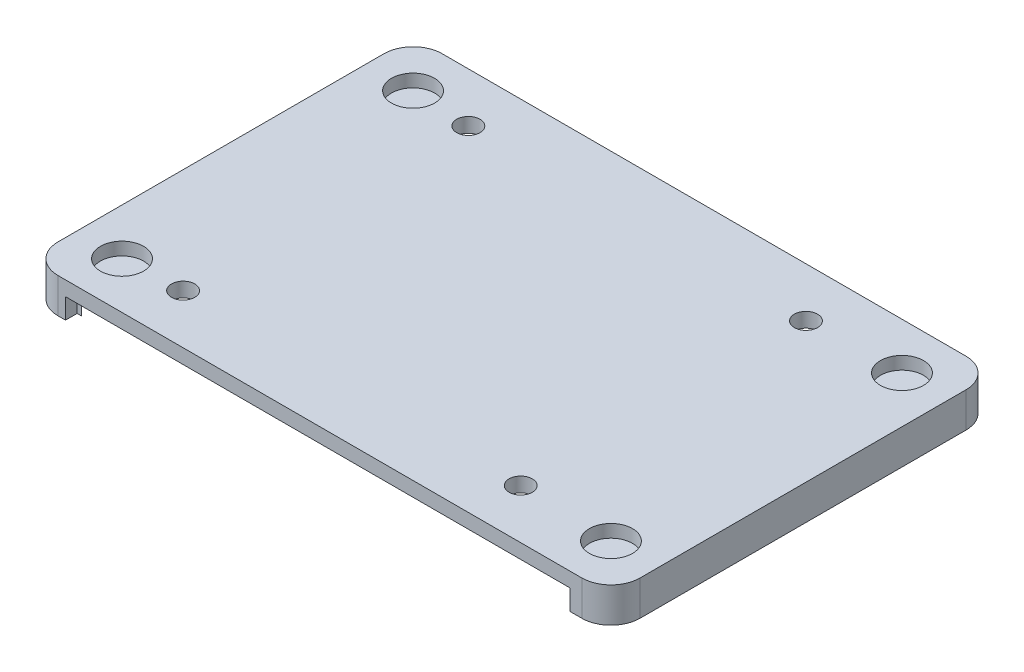
ISO-10303-21;
HEADER;
FILE_DESCRIPTION(('STEP AP214'),'2;1');
FILE_NAME('part.step','',(''),(''),'','','');
FILE_SCHEMA(('AUTOMOTIVE_DESIGN { 1 0 10303 214 1 1 1 1 }'));
ENDSEC;
DATA;
#1=APPLICATION_CONTEXT('core data for automotive mechanical design processes');
#2=APPLICATION_PROTOCOL_DEFINITION('international standard','automotive_design',2000,#1);
#3=PRODUCT_CONTEXT('',#1,'mechanical');
#4=PRODUCT('Part','Part','',(#3));
#5=PRODUCT_RELATED_PRODUCT_CATEGORY('part','',(#4));
#6=PRODUCT_DEFINITION_FORMATION('','',#4);
#7=PRODUCT_DEFINITION_CONTEXT('part definition',#1,'design');
#8=PRODUCT_DEFINITION('design','',#6,#7);
#9=PRODUCT_DEFINITION_SHAPE('','',#8);
#10=(LENGTH_UNIT() NAMED_UNIT(*) SI_UNIT(.MILLI.,.METRE.));
#11=(NAMED_UNIT(*) PLANE_ANGLE_UNIT() SI_UNIT($,.RADIAN.));
#12=(NAMED_UNIT(*) SI_UNIT($,.STERADIAN.) SOLID_ANGLE_UNIT());
#13=UNCERTAINTY_MEASURE_WITH_UNIT(LENGTH_MEASURE(1.E-05),#10,'distance_accuracy_value','');
#14=(GEOMETRIC_REPRESENTATION_CONTEXT(3) GLOBAL_UNCERTAINTY_ASSIGNED_CONTEXT((#13)) GLOBAL_UNIT_ASSIGNED_CONTEXT((#10,
#11,#12)) REPRESENTATION_CONTEXT('',''));
#15=CARTESIAN_POINT('',(0.,0.,0.));
#16=DIRECTION('',(0.,0.,1.));
#17=DIRECTION('',(1.,0.,0.));
#18=AXIS2_PLACEMENT_3D('',#15,#16,#17);
#19=CARTESIAN_POINT('',(0.,6.,-5.00000000000004));
#20=DIRECTION('',(-1.,0.,0.));
#21=DIRECTION('',(0.,0.,1.));
#22=AXIS2_PLACEMENT_3D('',#19,#20,#21);
#23=PLANE('',#22);
#24=DIRECTION('',(0.,-1.,0.));
#25=VECTOR('',#24,1.);
#26=CARTESIAN_POINT('',(0.,6.,-61.));
#27=LINE('',#26,#25);
#28=CARTESIAN_POINT('',(0.,6.,-61.));
#29=VERTEX_POINT('',#28);
#30=CARTESIAN_POINT('',(0.,3.5,-61.));
#31=VERTEX_POINT('',#30);
#32=EDGE_CURVE('E170',#29,#31,#27,.T.);
#33=ORIENTED_EDGE('',*,*,#32,.T.);
#34=DIRECTION('',(0.,0.,-1.));
#35=VECTOR('',#34,1.);
#36=CARTESIAN_POINT('',(0.,3.5,-5.00000000000004));
#37=LINE('',#36,#35);
#38=CARTESIAN_POINT('',(0.,3.5,-5.00000000000004));
#39=VERTEX_POINT('',#38);
#40=EDGE_CURVE('E275',#39,#31,#37,.T.);
#41=ORIENTED_EDGE('',*,*,#40,.F.);
#42=DIRECTION('',(0.,-1.,0.));
#43=VECTOR('',#42,1.);
#44=CARTESIAN_POINT('',(0.,6.,-5.00000000000004));
#45=LINE('',#44,#43);
#46=CARTESIAN_POINT('',(0.,6.,-5.00000000000004));
#47=VERTEX_POINT('',#46);
#48=EDGE_CURVE('E93',#47,#39,#45,.T.);
#49=ORIENTED_EDGE('',*,*,#48,.F.);
#50=DIRECTION('',(0.,0.,-1.));
#51=VECTOR('',#50,1.);
#52=CARTESIAN_POINT('',(0.,6.,-5.00000000000004));
#53=LINE('',#52,#51);
#54=EDGE_CURVE('E255',#47,#29,#53,.T.);
#55=ORIENTED_EDGE('',*,*,#54,.T.);
#56=EDGE_LOOP('',(#33,#41,#49,#55));
#57=FACE_BOUND('',#56,.T.);
#58=ADVANCED_FACE('F35',(#57),#23,.T.);
#59=CARTESIAN_POINT('',(5.,0.,-5.));
#60=DIRECTION('',(0.,-1.,0.));
#61=DIRECTION('',(0.,0.,-1.));
#62=AXIS2_PLACEMENT_3D('',#59,#60,#61);
#63=PLANE('',#62);
#64=DIRECTION('',(-1.,0.,0.));
#65=VECTOR('',#64,1.);
#66=CARTESIAN_POINT('',(0.,0.,-5.00000000000004));
#67=LINE('',#66,#65);
#68=CARTESIAN_POINT('',(2.41742430504418,0.,-5.00000000000004));
#69=VERTEX_POINT('',#68);
#70=CARTESIAN_POINT('',(0.,0.,-5.00000000000004));
#71=VERTEX_POINT('',#70);
#72=EDGE_CURVE('E545',#69,#71,#67,.T.);
#73=ORIENTED_EDGE('',*,*,#72,.F.);
#74=CARTESIAN_POINT('',(7.,0.,-7.));
#75=DIRECTION('',(0.,-1.,0.));
#76=DIRECTION('',(0.,0.,-1.));
#77=AXIS2_PLACEMENT_3D('',#74,#75,#76);
#78=CIRCLE('',#77,5.);
#79=CARTESIAN_POINT('',(7.00000000000006,0.,-2.));
#80=VERTEX_POINT('',#79);
#81=EDGE_CURVE('E232',#80,#69,#78,.T.);
#82=ORIENTED_EDGE('',*,*,#81,.F.);
#83=DIRECTION('',(1.,0.,0.));
#84=VECTOR('',#83,1.);
#85=CARTESIAN_POINT('',(93.,0.,-2.));
#86=LINE('',#85,#84);
#87=CARTESIAN_POINT('',(6.29077173658593,0.,-2.));
#88=VERTEX_POINT('',#87);
#89=EDGE_CURVE('E421',#88,#80,#86,.T.);
#90=ORIENTED_EDGE('',*,*,#89,.F.);
#91=DIRECTION('',(0.,0.,-1.));
#92=VECTOR('',#91,1.);
#93=CARTESIAN_POINT('',(6.29077173658593,0.,-2.));
#94=LINE('',#93,#92);
#95=CARTESIAN_POINT('',(6.29077173658593,0.,0.));
#96=VERTEX_POINT('',#95);
#97=EDGE_CURVE('E436',#96,#88,#94,.T.);
#98=ORIENTED_EDGE('',*,*,#97,.F.);
#99=DIRECTION('',(1.,0.,0.));
#100=VECTOR('',#99,1.);
#101=CARTESIAN_POINT('',(5.00000000000004,0.,0.));
#102=LINE('',#101,#100);
#103=CARTESIAN_POINT('',(5.00000000000004,0.,0.));
#104=VERTEX_POINT('',#103);
#105=EDGE_CURVE('E161',#104,#96,#102,.T.);
#106=ORIENTED_EDGE('',*,*,#105,.F.);
#107=CARTESIAN_POINT('',(5.,0.,-5.));
#108=DIRECTION('',(0.,-1.,0.));
#109=DIRECTION('',(0.,0.,-1.));
#110=AXIS2_PLACEMENT_3D('',#107,#108,#109);
#111=CIRCLE('',#110,5.);
#112=EDGE_CURVE('E144',#104,#71,#111,.T.);
#113=ORIENTED_EDGE('',*,*,#112,.T.);
#114=EDGE_LOOP('',(#73,#82,#90,#98,#106,#113));
#115=FACE_BOUND('',#114,.T.);
#116=ADVANCED_FACE('F378',(#115),#63,.T.);
#117=CARTESIAN_POINT('',(5.,6.,-5.));
#118=DIRECTION('',(0.,-1.,0.));
#119=DIRECTION('',(0.,0.,-1.));
#120=AXIS2_PLACEMENT_3D('',#117,#118,#119);
#121=CYLINDRICAL_SURFACE('',#120,5.);
#122=ORIENTED_EDGE('',*,*,#112,.F.);
#123=DIRECTION('',(0.,-1.,0.));
#124=VECTOR('',#123,1.);
#125=CARTESIAN_POINT('',(5.00000000000004,6.,0.));
#126=LINE('',#125,#124);
#127=CARTESIAN_POINT('',(5.00000000000004,6.,0.));
#128=VERTEX_POINT('',#127);
#129=EDGE_CURVE('E11',#128,#104,#126,.T.);
#130=ORIENTED_EDGE('',*,*,#129,.F.);
#131=CARTESIAN_POINT('',(5.,6.,-5.));
#132=DIRECTION('',(0.,-1.,0.));
#133=DIRECTION('',(0.,0.,-1.));
#134=AXIS2_PLACEMENT_3D('',#131,#132,#133);
#135=CIRCLE('',#134,5.);
#136=EDGE_CURVE('E162',#128,#47,#135,.T.);
#137=ORIENTED_EDGE('',*,*,#136,.T.);
#138=ORIENTED_EDGE('',*,*,#48,.T.);
#139=DIRECTION('',(0.,-1.,0.));
#140=VECTOR('',#139,1.);
#141=CARTESIAN_POINT('',(0.,3.5,-5.00000000000004));
#142=LINE('',#141,#140);
#143=EDGE_CURVE('E449',#39,#71,#142,.T.);
#144=ORIENTED_EDGE('',*,*,#143,.T.);
#145=EDGE_LOOP('',(#122,#130,#137,#138,#144));
#146=FACE_BOUND('',#145,.T.);
#147=ADVANCED_FACE('F37',(#146),#121,.T.);
#148=CARTESIAN_POINT('',(5.00000000000004,6.,0.));
#149=DIRECTION('',(0.,0.,-1.));
#150=DIRECTION('',(-1.,0.,0.));
#151=AXIS2_PLACEMENT_3D('',#148,#149,#150);
#152=PLANE('',#151);
#153=DIRECTION('',(-1.,0.,0.));
#154=VECTOR('',#153,1.);
#155=CARTESIAN_POINT('',(93.,3.5,0.));
#156=LINE('',#155,#154);
#157=CARTESIAN_POINT('',(93.,3.5,0.));
#158=VERTEX_POINT('',#157);
#159=CARTESIAN_POINT('',(6.29077173658593,3.5,0.));
#160=VERTEX_POINT('',#159);
#161=EDGE_CURVE('E418',#158,#160,#156,.T.);
#162=ORIENTED_EDGE('',*,*,#161,.F.);
#163=DIRECTION('',(0.,-1.,0.));
#164=VECTOR('',#163,1.);
#165=CARTESIAN_POINT('',(93.,3.5,0.));
#166=LINE('',#165,#164);
#167=CARTESIAN_POINT('',(93.,0.,0.));
#168=VERTEX_POINT('',#167);
#169=EDGE_CURVE('E424',#158,#168,#166,.T.);
#170=ORIENTED_EDGE('',*,*,#169,.T.);
#171=CARTESIAN_POINT('',(95.,0.,0.));
#172=VERTEX_POINT('',#171);
#173=EDGE_CURVE('E160',#168,#172,#102,.T.);
#174=ORIENTED_EDGE('',*,*,#173,.T.);
#175=DIRECTION('',(0.,-1.,0.));
#176=VECTOR('',#175,1.);
#177=CARTESIAN_POINT('',(95.,6.,0.));
#178=LINE('',#177,#176);
#179=CARTESIAN_POINT('',(95.,6.,0.));
#180=VERTEX_POINT('',#179);
#181=EDGE_CURVE('E44',#180,#172,#178,.T.);
#182=ORIENTED_EDGE('',*,*,#181,.F.);
#183=DIRECTION('',(1.,0.,0.));
#184=VECTOR('',#183,1.);
#185=CARTESIAN_POINT('',(5.00000000000004,6.,0.));
#186=LINE('',#185,#184);
#187=EDGE_CURVE('E120',#128,#180,#186,.T.);
#188=ORIENTED_EDGE('',*,*,#187,.F.);
#189=ORIENTED_EDGE('',*,*,#129,.T.);
#190=ORIENTED_EDGE('',*,*,#105,.T.);
#191=DIRECTION('',(0.,-1.,0.));
#192=VECTOR('',#191,1.);
#193=CARTESIAN_POINT('',(6.29077173658593,3.5,0.));
#194=LINE('',#193,#192);
#195=EDGE_CURVE('E426',#160,#96,#194,.T.);
#196=ORIENTED_EDGE('',*,*,#195,.F.);
#197=EDGE_LOOP('',(#162,#170,#174,#182,#188,#189,#190,#196));
#198=FACE_BOUND('',#197,.T.);
#199=ADVANCED_FACE('F397',(#198),#152,.F.);
#200=CARTESIAN_POINT('',(95.,6.,-5.));
#201=DIRECTION('',(0.,-1.,0.));
#202=DIRECTION('',(0.,0.,-1.));
#203=AXIS2_PLACEMENT_3D('',#200,#201,#202);
#204=CYLINDRICAL_SURFACE('',#203,5.);
#205=CARTESIAN_POINT('',(95.,0.,-5.));
#206=DIRECTION('',(0.,1.,0.));
#207=DIRECTION('',(0.,0.,1.));
#208=AXIS2_PLACEMENT_3D('',#205,#206,#207);
#209=CIRCLE('',#208,5.);
#210=CARTESIAN_POINT('',(100.,0.,-5.00000000000004));
#211=VERTEX_POINT('',#210);
#212=EDGE_CURVE('E129',#172,#211,#209,.T.);
#213=ORIENTED_EDGE('',*,*,#212,.T.);
#214=DIRECTION('',(0.,-1.,0.));
#215=VECTOR('',#214,1.);
#216=CARTESIAN_POINT('',(100.,6.,-5.00000000000004));
#217=LINE('',#216,#215);
#218=CARTESIAN_POINT('',(100.,6.,-5.00000000000004));
#219=VERTEX_POINT('',#218);
#220=EDGE_CURVE('E126',#219,#211,#217,.T.);
#221=ORIENTED_EDGE('',*,*,#220,.F.);
#222=CARTESIAN_POINT('',(95.,6.,-5.));
#223=DIRECTION('',(0.,1.,0.));
#224=DIRECTION('',(0.,0.,1.));
#225=AXIS2_PLACEMENT_3D('',#222,#223,#224);
#226=CIRCLE('',#225,5.);
#227=EDGE_CURVE('E112',#180,#219,#226,.T.);
#228=ORIENTED_EDGE('',*,*,#227,.F.);
#229=ORIENTED_EDGE('',*,*,#181,.T.);
#230=EDGE_LOOP('',(#213,#221,#228,#229));
#231=FACE_BOUND('',#230,.T.);
#232=ADVANCED_FACE('F127',(#231),#204,.T.);
#233=CARTESIAN_POINT('',(100.,6.,-5.00000000000004));
#234=DIRECTION('',(-1.,0.,0.));
#235=DIRECTION('',(0.,0.,1.));
#236=AXIS2_PLACEMENT_3D('',#233,#234,#235);
#237=PLANE('',#236);
#238=DIRECTION('',(0.,0.,-1.));
#239=VECTOR('',#238,1.);
#240=CARTESIAN_POINT('',(100.,0.,-5.00000000000004));
#241=LINE('',#240,#239);
#242=CARTESIAN_POINT('',(100.,0.,-61.));
#243=VERTEX_POINT('',#242);
#244=EDGE_CURVE('E157',#211,#243,#241,.T.);
#245=ORIENTED_EDGE('',*,*,#244,.T.);
#246=DIRECTION('',(0.,-1.,0.));
#247=VECTOR('',#246,1.);
#248=CARTESIAN_POINT('',(100.,6.,-61.));
#249=LINE('',#248,#247);
#250=CARTESIAN_POINT('',(100.,6.,-61.));
#251=VERTEX_POINT('',#250);
#252=EDGE_CURVE('E133',#251,#243,#249,.T.);
#253=ORIENTED_EDGE('',*,*,#252,.F.);
#254=DIRECTION('',(0.,0.,-1.));
#255=VECTOR('',#254,1.);
#256=CARTESIAN_POINT('',(100.,6.,-5.00000000000004));
#257=LINE('',#256,#255);
#258=EDGE_CURVE('E118',#219,#251,#257,.T.);
#259=ORIENTED_EDGE('',*,*,#258,.F.);
#260=ORIENTED_EDGE('',*,*,#220,.T.);
#261=EDGE_LOOP('',(#245,#253,#259,#260));
#262=FACE_BOUND('',#261,.T.);
#263=ADVANCED_FACE('F135',(#262),#237,.F.);
#264=CARTESIAN_POINT('',(95.,6.,-61.));
#265=DIRECTION('',(0.,-1.,0.));
#266=DIRECTION('',(0.,0.,-1.));
#267=AXIS2_PLACEMENT_3D('',#264,#265,#266);
#268=CYLINDRICAL_SURFACE('',#267,5.);
#269=CARTESIAN_POINT('',(95.,0.,-61.));
#270=DIRECTION('',(0.,-1.,0.));
#271=DIRECTION('',(0.,0.,-1.));
#272=AXIS2_PLACEMENT_3D('',#269,#270,#271);
#273=CIRCLE('',#272,5.);
#274=CARTESIAN_POINT('',(95.,0.,-66.));
#275=VERTEX_POINT('',#274);
#276=EDGE_CURVE('E154',#275,#243,#273,.T.);
#277=ORIENTED_EDGE('',*,*,#276,.F.);
#278=DIRECTION('',(0.,-1.,0.));
#279=VECTOR('',#278,1.);
#280=CARTESIAN_POINT('',(95.,6.,-66.));
#281=LINE('',#280,#279);
#282=CARTESIAN_POINT('',(95.,6.,-66.));
#283=VERTEX_POINT('',#282);
#284=EDGE_CURVE('E166',#283,#275,#281,.T.);
#285=ORIENTED_EDGE('',*,*,#284,.F.);
#286=CARTESIAN_POINT('',(95.,6.,-61.));
#287=DIRECTION('',(0.,-1.,0.));
#288=DIRECTION('',(0.,0.,-1.));
#289=AXIS2_PLACEMENT_3D('',#286,#287,#288);
#290=CIRCLE('',#289,5.);
#291=EDGE_CURVE('E137',#283,#251,#290,.T.);
#292=ORIENTED_EDGE('',*,*,#291,.T.);
#293=ORIENTED_EDGE('',*,*,#252,.T.);
#294=EDGE_LOOP('',(#277,#285,#292,#293));
#295=FACE_BOUND('',#294,.T.);
#296=ADVANCED_FACE('F389',(#295),#268,.T.);
#297=CARTESIAN_POINT('',(5.00000000000004,6.,-66.));
#298=DIRECTION('',(0.,0.,-1.));
#299=DIRECTION('',(-1.,0.,0.));
#300=AXIS2_PLACEMENT_3D('',#297,#298,#299);
#301=PLANE('',#300);
#302=DIRECTION('',(1.,0.,0.));
#303=VECTOR('',#302,1.);
#304=CARTESIAN_POINT('',(5.00000000000004,0.,-66.));
#305=LINE('',#304,#303);
#306=CARTESIAN_POINT('',(5.,0.,-66.));
#307=VERTEX_POINT('',#306);
#308=EDGE_CURVE('E151',#307,#275,#305,.T.);
#309=ORIENTED_EDGE('',*,*,#308,.F.);
#310=DIRECTION('',(0.,-1.,0.));
#311=VECTOR('',#310,1.);
#312=CARTESIAN_POINT('',(5.,6.,-66.));
#313=LINE('',#312,#311);
#314=CARTESIAN_POINT('',(5.,6.,-66.));
#315=VERTEX_POINT('',#314);
#316=EDGE_CURVE('E168',#315,#307,#313,.T.);
#317=ORIENTED_EDGE('',*,*,#316,.F.);
#318=DIRECTION('',(1.,0.,0.));
#319=VECTOR('',#318,1.);
#320=CARTESIAN_POINT('',(5.00000000000004,6.,-66.));
#321=LINE('',#320,#319);
#322=EDGE_CURVE('E139',#315,#283,#321,.T.);
#323=ORIENTED_EDGE('',*,*,#322,.T.);
#324=ORIENTED_EDGE('',*,*,#284,.T.);
#325=EDGE_LOOP('',(#309,#317,#323,#324));
#326=FACE_BOUND('',#325,.T.);
#327=ADVANCED_FACE('F263',(#326),#301,.T.);
#328=CARTESIAN_POINT('',(5.,6.,-61.));
#329=DIRECTION('',(0.,-1.,0.));
#330=DIRECTION('',(0.,0.,-1.));
#331=AXIS2_PLACEMENT_3D('',#328,#329,#330);
#332=CYLINDRICAL_SURFACE('',#331,5.);
#333=CARTESIAN_POINT('',(5.,0.,-61.));
#334=DIRECTION('',(0.,-1.,0.));
#335=DIRECTION('',(0.,0.,-1.));
#336=AXIS2_PLACEMENT_3D('',#333,#334,#335);
#337=CIRCLE('',#336,5.);
#338=CARTESIAN_POINT('',(0.,0.,-61.));
#339=VERTEX_POINT('',#338);
#340=EDGE_CURVE('E147',#339,#307,#337,.T.);
#341=ORIENTED_EDGE('',*,*,#340,.F.);
#342=DIRECTION('',(0.,-1.,0.));
#343=VECTOR('',#342,1.);
#344=CARTESIAN_POINT('',(0.,3.5,-61.));
#345=LINE('',#344,#343);
#346=EDGE_CURVE('E272',#31,#339,#345,.T.);
#347=ORIENTED_EDGE('',*,*,#346,.F.);
#348=ORIENTED_EDGE('',*,*,#32,.F.);
#349=CARTESIAN_POINT('',(5.,6.,-61.));
#350=DIRECTION('',(0.,-1.,0.));
#351=DIRECTION('',(0.,0.,-1.));
#352=AXIS2_PLACEMENT_3D('',#349,#350,#351);
#353=CIRCLE('',#352,5.);
#354=EDGE_CURVE('E257',#29,#315,#353,.T.);
#355=ORIENTED_EDGE('',*,*,#354,.T.);
#356=ORIENTED_EDGE('',*,*,#316,.T.);
#357=EDGE_LOOP('',(#341,#347,#348,#355,#356));
#358=FACE_BOUND('',#357,.T.);
#359=ADVANCED_FACE('F268',(#358),#332,.T.);
#360=CARTESIAN_POINT('',(5.,6.,-5.));
#361=DIRECTION('',(0.,-1.,0.));
#362=DIRECTION('',(0.,0.,-1.));
#363=AXIS2_PLACEMENT_3D('',#360,#361,#362);
#364=PLANE('',#363);
#365=CARTESIAN_POINT('',(18.,6.,-8.5));
#366=DIRECTION('',(0.,1.,0.));
#367=DIRECTION('',(0.,0.,1.));
#368=AXIS2_PLACEMENT_3D('',#365,#366,#367);
#369=CIRCLE('',#368,2.);
#370=CARTESIAN_POINT('',(18.,6.,-6.5));
#371=VERTEX_POINT('',#370);
#372=EDGE_CURVE('E450',#371,#371,#369,.T.);
#373=ORIENTED_EDGE('',*,*,#372,.F.);
#374=EDGE_LOOP('',(#373));
#375=FACE_BOUND('',#374,.T.);
#376=CARTESIAN_POINT('',(76.,6.,-57.5));
#377=DIRECTION('',(0.,1.,0.));
#378=DIRECTION('',(0.,0.,1.));
#379=AXIS2_PLACEMENT_3D('',#376,#377,#378);
#380=CIRCLE('',#379,2.);
#381=CARTESIAN_POINT('',(76.,6.,-55.5));
#382=VERTEX_POINT('',#381);
#383=EDGE_CURVE('E448',#382,#382,#380,.T.);
#384=ORIENTED_EDGE('',*,*,#383,.F.);
#385=EDGE_LOOP('',(#384));
#386=FACE_BOUND('',#385,.T.);
#387=CARTESIAN_POINT('',(76.,6.,-8.5));
#388=DIRECTION('',(0.,1.,0.));
#389=DIRECTION('',(0.,0.,1.));
#390=AXIS2_PLACEMENT_3D('',#387,#388,#389);
#391=CIRCLE('',#390,2.);
#392=CARTESIAN_POINT('',(76.,6.,-6.5));
#393=VERTEX_POINT('',#392);
#394=EDGE_CURVE('E445',#393,#393,#391,.T.);
#395=ORIENTED_EDGE('',*,*,#394,.F.);
#396=EDGE_LOOP('',(#395));
#397=FACE_BOUND('',#396,.T.);
#398=CARTESIAN_POINT('',(18.,6.,-57.5));
#399=DIRECTION('',(0.,1.,0.));
#400=DIRECTION('',(0.,0.,1.));
#401=AXIS2_PLACEMENT_3D('',#398,#399,#400);
#402=CIRCLE('',#401,2.);
#403=CARTESIAN_POINT('',(18.,6.,-55.5));
#404=VERTEX_POINT('',#403);
#405=EDGE_CURVE('E178',#404,#404,#402,.T.);
#406=ORIENTED_EDGE('',*,*,#405,.F.);
#407=EDGE_LOOP('',(#406));
#408=FACE_BOUND('',#407,.T.);
#409=CARTESIAN_POINT('',(92.,6.,-58.));
#410=DIRECTION('',(0.,1.,0.));
#411=DIRECTION('',(0.,0.,1.));
#412=AXIS2_PLACEMENT_3D('',#409,#410,#411);
#413=CIRCLE('',#412,3.7);
#414=CARTESIAN_POINT('',(92.,6.,-54.3));
#415=VERTEX_POINT('',#414);
#416=EDGE_CURVE('E185',#415,#415,#413,.T.);
#417=ORIENTED_EDGE('',*,*,#416,.F.);
#418=EDGE_LOOP('',(#417));
#419=FACE_BOUND('',#418,.T.);
#420=CARTESIAN_POINT('',(92.,6.,-8.));
#421=DIRECTION('',(0.,1.,0.));
#422=DIRECTION('',(0.,0.,1.));
#423=AXIS2_PLACEMENT_3D('',#420,#421,#422);
#424=CIRCLE('',#423,3.69999999999999);
#425=CARTESIAN_POINT('',(92.,6.,-4.30000000000001));
#426=VERTEX_POINT('',#425);
#427=EDGE_CURVE('E194',#426,#426,#424,.T.);
#428=ORIENTED_EDGE('',*,*,#427,.F.);
#429=EDGE_LOOP('',(#428));
#430=FACE_BOUND('',#429,.T.);
#431=CARTESIAN_POINT('',(8.,6.,-8.));
#432=DIRECTION('',(0.,1.,0.));
#433=DIRECTION('',(0.,0.,1.));
#434=AXIS2_PLACEMENT_3D('',#431,#432,#433);
#435=CIRCLE('',#434,3.7);
#436=CARTESIAN_POINT('',(8.,6.,-4.3));
#437=VERTEX_POINT('',#436);
#438=EDGE_CURVE('E459',#437,#437,#435,.T.);
#439=ORIENTED_EDGE('',*,*,#438,.F.);
#440=EDGE_LOOP('',(#439));
#441=FACE_BOUND('',#440,.T.);
#442=CARTESIAN_POINT('',(8.,6.,-58.));
#443=DIRECTION('',(0.,1.,0.));
#444=DIRECTION('',(0.,0.,1.));
#445=AXIS2_PLACEMENT_3D('',#442,#443,#444);
#446=CIRCLE('',#445,3.7);
#447=CARTESIAN_POINT('',(8.,6.,-54.3));
#448=VERTEX_POINT('',#447);
#449=EDGE_CURVE('E201',#448,#448,#446,.T.);
#450=ORIENTED_EDGE('',*,*,#449,.F.);
#451=EDGE_LOOP('',(#450));
#452=FACE_BOUND('',#451,.T.);
#453=ORIENTED_EDGE('',*,*,#136,.F.);
#454=ORIENTED_EDGE('',*,*,#187,.T.);
#455=ORIENTED_EDGE('',*,*,#227,.T.);
#456=ORIENTED_EDGE('',*,*,#258,.T.);
#457=ORIENTED_EDGE('',*,*,#291,.F.);
#458=ORIENTED_EDGE('',*,*,#322,.F.);
#459=ORIENTED_EDGE('',*,*,#354,.F.);
#460=ORIENTED_EDGE('',*,*,#54,.F.);
#461=EDGE_LOOP('',(#453,#454,#455,#456,#457,#458,#459,#460));
#462=FACE_BOUND('',#461,.T.);
#463=ADVANCED_FACE('F115',(#375,#386,#397,#408,#419,#430,#441,#452,#462),#364,.F.);
#464=DIRECTION('',(1.,0.,0.));
#465=VECTOR('',#464,1.);
#466=CARTESIAN_POINT('',(0.,0.,-61.));
#467=LINE('',#466,#465);
#468=CARTESIAN_POINT('',(2.41742430504418,0.,-61.));
#469=VERTEX_POINT('',#468);
#470=EDGE_CURVE('E442',#339,#469,#467,.T.);
#471=ORIENTED_EDGE('',*,*,#470,.F.);
#472=ORIENTED_EDGE('',*,*,#340,.T.);
#473=ORIENTED_EDGE('',*,*,#308,.T.);
#474=ORIENTED_EDGE('',*,*,#276,.T.);
#475=ORIENTED_EDGE('',*,*,#244,.F.);
#476=ORIENTED_EDGE('',*,*,#212,.F.);
#477=ORIENTED_EDGE('',*,*,#173,.F.);
#478=DIRECTION('',(0.,0.,1.));
#479=VECTOR('',#478,1.);
#480=CARTESIAN_POINT('',(93.,0.,-2.));
#481=LINE('',#480,#479);
#482=CARTESIAN_POINT('',(93.,0.,-2.));
#483=VERTEX_POINT('',#482);
#484=EDGE_CURVE('E434',#483,#168,#481,.T.);
#485=ORIENTED_EDGE('',*,*,#484,.F.);
#486=CARTESIAN_POINT('',(93.,0.,-7.));
#487=DIRECTION('',(0.,-1.,0.));
#488=DIRECTION('',(0.,0.,1.));
#489=AXIS2_PLACEMENT_3D('',#486,#487,#488);
#490=CIRCLE('',#489,5.);
#491=CARTESIAN_POINT('',(98.,0.,-7.00000000000003));
#492=VERTEX_POINT('',#491);
#493=EDGE_CURVE('E229',#492,#483,#490,.T.);
#494=ORIENTED_EDGE('',*,*,#493,.F.);
#495=DIRECTION('',(0.,0.,1.));
#496=VECTOR('',#495,1.);
#497=CARTESIAN_POINT('',(98.,0.,-7.00000000000003));
#498=LINE('',#497,#496);
#499=CARTESIAN_POINT('',(98.,0.,-59.));
#500=VERTEX_POINT('',#499);
#501=EDGE_CURVE('E226',#500,#492,#498,.T.);
#502=ORIENTED_EDGE('',*,*,#501,.F.);
#503=CARTESIAN_POINT('',(93.,0.,-59.));
#504=DIRECTION('',(0.,-1.,0.));
#505=DIRECTION('',(0.,0.,-1.));
#506=AXIS2_PLACEMENT_3D('',#503,#504,#505);
#507=CIRCLE('',#506,5.);
#508=CARTESIAN_POINT('',(93.,0.,-64.));
#509=VERTEX_POINT('',#508);
#510=EDGE_CURVE('E52',#509,#500,#507,.T.);
#511=ORIENTED_EDGE('',*,*,#510,.F.);
#512=DIRECTION('',(1.,0.,0.));
#513=VECTOR('',#512,1.);
#514=CARTESIAN_POINT('',(7.00000000000004,0.,-64.));
#515=LINE('',#514,#513);
#516=CARTESIAN_POINT('',(7.00000000000004,0.,-64.));
#517=VERTEX_POINT('',#516);
#518=EDGE_CURVE('E209',#517,#509,#515,.T.);
#519=ORIENTED_EDGE('',*,*,#518,.F.);
#520=CARTESIAN_POINT('',(7.00000000000001,0.,-59.));
#521=DIRECTION('',(0.,-1.,0.));
#522=DIRECTION('',(0.,0.,-1.));
#523=AXIS2_PLACEMENT_3D('',#520,#521,#522);
#524=CIRCLE('',#523,5.);
#525=EDGE_CURVE('E235',#469,#517,#524,.T.);
#526=ORIENTED_EDGE('',*,*,#525,.F.);
#527=EDGE_LOOP('',(#471,#472,#473,#474,#475,#476,#477,#485,#494,#502,#511,#519,#526));
#528=FACE_BOUND('',#527,.T.);
#529=ADVANCED_FACE('F354',(#528),#63,.T.);
#530=CARTESIAN_POINT('',(93.,3.5,-59.));
#531=DIRECTION('',(0.,-1.,0.));
#532=DIRECTION('',(0.,0.,-1.));
#533=AXIS2_PLACEMENT_3D('',#530,#531,#532);
#534=CYLINDRICAL_SURFACE('',#533,5.);
#535=ORIENTED_EDGE('',*,*,#510,.T.);
#536=DIRECTION('',(0.,-1.,0.));
#537=VECTOR('',#536,1.);
#538=CARTESIAN_POINT('',(98.,3.5,-59.));
#539=LINE('',#538,#537);
#540=CARTESIAN_POINT('',(98.,3.5,-59.));
#541=VERTEX_POINT('',#540);
#542=EDGE_CURVE('E224',#541,#500,#539,.T.);
#543=ORIENTED_EDGE('',*,*,#542,.F.);
#544=CARTESIAN_POINT('',(93.,3.5,-59.));
#545=DIRECTION('',(0.,-1.,0.));
#546=DIRECTION('',(0.,0.,-1.));
#547=AXIS2_PLACEMENT_3D('',#544,#545,#546);
#548=CIRCLE('',#547,5.);
#549=CARTESIAN_POINT('',(93.,3.5,-64.));
#550=VERTEX_POINT('',#549);
#551=EDGE_CURVE('E205',#550,#541,#548,.T.);
#552=ORIENTED_EDGE('',*,*,#551,.F.);
#553=DIRECTION('',(0.,-1.,0.));
#554=VECTOR('',#553,1.);
#555=CARTESIAN_POINT('',(93.,3.5,-64.));
#556=LINE('',#555,#554);
#557=EDGE_CURVE('E148',#550,#509,#556,.T.);
#558=ORIENTED_EDGE('',*,*,#557,.T.);
#559=EDGE_LOOP('',(#535,#543,#552,#558));
#560=FACE_BOUND('',#559,.T.);
#561=ADVANCED_FACE('F346',(#560),#534,.F.);
#562=CARTESIAN_POINT('',(7.00000000000004,3.5,-64.));
#563=DIRECTION('',(0.,0.,-1.));
#564=DIRECTION('',(-1.,0.,0.));
#565=AXIS2_PLACEMENT_3D('',#562,#563,#564);
#566=PLANE('',#565);
#567=ORIENTED_EDGE('',*,*,#518,.T.);
#568=ORIENTED_EDGE('',*,*,#557,.F.);
#569=DIRECTION('',(1.,0.,0.));
#570=VECTOR('',#569,1.);
#571=CARTESIAN_POINT('',(7.00000000000004,3.5,-64.));
#572=LINE('',#571,#570);
#573=CARTESIAN_POINT('',(7.00000000000004,3.5,-64.));
#574=VERTEX_POINT('',#573);
#575=EDGE_CURVE('E221',#574,#550,#572,.T.);
#576=ORIENTED_EDGE('',*,*,#575,.F.);
#577=DIRECTION('',(0.,-1.,0.));
#578=VECTOR('',#577,1.);
#579=CARTESIAN_POINT('',(7.00000000000004,3.5,-64.));
#580=LINE('',#579,#578);
#581=EDGE_CURVE('E241',#574,#517,#580,.T.);
#582=ORIENTED_EDGE('',*,*,#581,.T.);
#583=EDGE_LOOP('',(#567,#568,#576,#582));
#584=FACE_BOUND('',#583,.T.);
#585=ADVANCED_FACE('F350',(#584),#566,.F.);
#586=CARTESIAN_POINT('',(7.00000000000001,3.5,-59.));
#587=DIRECTION('',(0.,-1.,0.));
#588=DIRECTION('',(0.,0.,-1.));
#589=AXIS2_PLACEMENT_3D('',#586,#587,#588);
#590=CYLINDRICAL_SURFACE('',#589,5.);
#591=CARTESIAN_POINT('',(7.00000000000001,3.5,-59.));
#592=DIRECTION('',(0.,-1.,0.));
#593=DIRECTION('',(0.,0.,-1.));
#594=AXIS2_PLACEMENT_3D('',#591,#592,#593);
#595=CIRCLE('',#594,5.);
#596=CARTESIAN_POINT('',(2.41742430504418,3.5,-61.));
#597=VERTEX_POINT('',#596);
#598=EDGE_CURVE('E218',#597,#574,#595,.T.);
#599=ORIENTED_EDGE('',*,*,#598,.F.);
#600=DIRECTION('',(0.,-1.,0.));
#601=VECTOR('',#600,1.);
#602=CARTESIAN_POINT('',(2.41742430504418,3.5,-61.));
#603=LINE('',#602,#601);
#604=EDGE_CURVE('E560',#597,#469,#603,.T.);
#605=ORIENTED_EDGE('',*,*,#604,.T.);
#606=ORIENTED_EDGE('',*,*,#525,.T.);
#607=ORIENTED_EDGE('',*,*,#581,.F.);
#608=EDGE_LOOP('',(#599,#605,#606,#607));
#609=FACE_BOUND('',#608,.T.);
#610=ADVANCED_FACE('F365',(#609),#590,.F.);
#611=CARTESIAN_POINT('',(7.,3.5,-7.));
#612=DIRECTION('',(0.,-1.,0.));
#613=DIRECTION('',(0.,0.,-1.));
#614=AXIS2_PLACEMENT_3D('',#611,#612,#613);
#615=CYLINDRICAL_SURFACE('',#614,5.);
#616=ORIENTED_EDGE('',*,*,#81,.T.);
#617=DIRECTION('',(0.,-1.,0.));
#618=VECTOR('',#617,1.);
#619=CARTESIAN_POINT('',(2.41742430504418,3.5,-5.00000000000004));
#620=LINE('',#619,#618);
#621=CARTESIAN_POINT('',(2.41742430504418,3.5,-5.00000000000004));
#622=VERTEX_POINT('',#621);
#623=EDGE_CURVE('E549',#622,#69,#620,.T.);
#624=ORIENTED_EDGE('',*,*,#623,.F.);
#625=CARTESIAN_POINT('',(7.,3.5,-7.));
#626=DIRECTION('',(0.,-1.,0.));
#627=DIRECTION('',(0.,0.,-1.));
#628=AXIS2_PLACEMENT_3D('',#625,#626,#627);
#629=CIRCLE('',#628,5.);
#630=CARTESIAN_POINT('',(7.00000000000004,3.5,-2.));
#631=VERTEX_POINT('',#630);
#632=EDGE_CURVE('E215',#631,#622,#629,.T.);
#633=ORIENTED_EDGE('',*,*,#632,.F.);
#634=DIRECTION('',(0.,-1.,0.));
#635=VECTOR('',#634,1.);
#636=CARTESIAN_POINT('',(7.00000000000004,3.5,-2.));
#637=LINE('',#636,#635);
#638=EDGE_CURVE('E244',#631,#80,#637,.T.);
#639=ORIENTED_EDGE('',*,*,#638,.T.);
#640=EDGE_LOOP('',(#616,#624,#633,#639));
#641=FACE_BOUND('',#640,.T.);
#642=ADVANCED_FACE('F367',(#641),#615,.F.);
#643=CARTESIAN_POINT('',(93.,3.5,-7.));
#644=DIRECTION('',(0.,-1.,0.));
#645=DIRECTION('',(0.,0.,-1.));
#646=AXIS2_PLACEMENT_3D('',#643,#644,#645);
#647=CYLINDRICAL_SURFACE('',#646,5.);
#648=ORIENTED_EDGE('',*,*,#493,.T.);
#649=DIRECTION('',(0.,-1.,0.));
#650=VECTOR('',#649,1.);
#651=CARTESIAN_POINT('',(93.,3.5,-2.));
#652=LINE('',#651,#650);
#653=CARTESIAN_POINT('',(93.,3.5,-2.));
#654=VERTEX_POINT('',#653);
#655=EDGE_CURVE('E247',#654,#483,#652,.T.);
#656=ORIENTED_EDGE('',*,*,#655,.F.);
#657=CARTESIAN_POINT('',(93.,3.5,-7.));
#658=DIRECTION('',(0.,-1.,0.));
#659=DIRECTION('',(0.,0.,1.));
#660=AXIS2_PLACEMENT_3D('',#657,#658,#659);
#661=CIRCLE('',#660,5.);
#662=CARTESIAN_POINT('',(98.,3.5,-7.00000000000003));
#663=VERTEX_POINT('',#662);
#664=EDGE_CURVE('E212',#663,#654,#661,.T.);
#665=ORIENTED_EDGE('',*,*,#664,.F.);
#666=DIRECTION('',(0.,-1.,0.));
#667=VECTOR('',#666,1.);
#668=CARTESIAN_POINT('',(98.,3.5,-7.00000000000003));
#669=LINE('',#668,#667);
#670=EDGE_CURVE('E250',#663,#492,#669,.T.);
#671=ORIENTED_EDGE('',*,*,#670,.T.);
#672=EDGE_LOOP('',(#648,#656,#665,#671));
#673=FACE_BOUND('',#672,.T.);
#674=ADVANCED_FACE('F373',(#673),#647,.F.);
#675=CARTESIAN_POINT('',(98.,3.5,-7.00000000000003));
#676=DIRECTION('',(1.,0.,0.));
#677=DIRECTION('',(0.,0.,-1.));
#678=AXIS2_PLACEMENT_3D('',#675,#676,#677);
#679=PLANE('',#678);
#680=ORIENTED_EDGE('',*,*,#501,.T.);
#681=ORIENTED_EDGE('',*,*,#670,.F.);
#682=DIRECTION('',(0.,0.,1.));
#683=VECTOR('',#682,1.);
#684=CARTESIAN_POINT('',(98.,3.5,-7.00000000000003));
#685=LINE('',#684,#683);
#686=EDGE_CURVE('E208',#541,#663,#685,.T.);
#687=ORIENTED_EDGE('',*,*,#686,.F.);
#688=ORIENTED_EDGE('',*,*,#542,.T.);
#689=EDGE_LOOP('',(#680,#681,#687,#688));
#690=FACE_BOUND('',#689,.T.);
#691=ADVANCED_FACE('F358',(#690),#679,.F.);
#692=CARTESIAN_POINT('',(93.,3.5,-59.));
#693=DIRECTION('',(0.,-1.,0.));
#694=DIRECTION('',(0.,0.,-1.));
#695=AXIS2_PLACEMENT_3D('',#692,#693,#694);
#696=PLANE('',#695);
#697=DIRECTION('',(1.,0.,0.));
#698=VECTOR('',#697,1.);
#699=CARTESIAN_POINT('',(0.,3.5,-61.));
#700=LINE('',#699,#698);
#701=EDGE_CURVE('E283',#31,#597,#700,.T.);
#702=ORIENTED_EDGE('',*,*,#701,.T.);
#703=ORIENTED_EDGE('',*,*,#598,.T.);
#704=ORIENTED_EDGE('',*,*,#575,.T.);
#705=ORIENTED_EDGE('',*,*,#551,.T.);
#706=ORIENTED_EDGE('',*,*,#686,.T.);
#707=ORIENTED_EDGE('',*,*,#664,.T.);
#708=DIRECTION('',(0.,0.,1.));
#709=VECTOR('',#708,1.);
#710=CARTESIAN_POINT('',(93.,3.5,-2.));
#711=LINE('',#710,#709);
#712=EDGE_CURVE('E415',#654,#158,#711,.T.);
#713=ORIENTED_EDGE('',*,*,#712,.T.);
#714=ORIENTED_EDGE('',*,*,#161,.T.);
#715=DIRECTION('',(0.,0.,-1.));
#716=VECTOR('',#715,1.);
#717=CARTESIAN_POINT('',(6.29077173658593,3.5,-2.));
#718=LINE('',#717,#716);
#719=CARTESIAN_POINT('',(6.29077173658593,3.5,-2.));
#720=VERTEX_POINT('',#719);
#721=EDGE_CURVE('E427',#160,#720,#718,.T.);
#722=ORIENTED_EDGE('',*,*,#721,.T.);
#723=DIRECTION('',(1.,0.,0.));
#724=VECTOR('',#723,1.);
#725=CARTESIAN_POINT('',(93.,3.5,-2.));
#726=LINE('',#725,#724);
#727=EDGE_CURVE('E429',#720,#631,#726,.T.);
#728=ORIENTED_EDGE('',*,*,#727,.T.);
#729=ORIENTED_EDGE('',*,*,#632,.T.);
#730=DIRECTION('',(-1.,0.,0.));
#731=VECTOR('',#730,1.);
#732=CARTESIAN_POINT('',(0.,3.5,-5.00000000000004));
#733=LINE('',#732,#731);
#734=EDGE_CURVE('E558',#622,#39,#733,.T.);
#735=ORIENTED_EDGE('',*,*,#734,.T.);
#736=ORIENTED_EDGE('',*,*,#40,.T.);
#737=EDGE_LOOP('',(#702,#703,#704,#705,#706,#707,#713,#714,#722,#728,#729,#735,#736));
#738=FACE_BOUND('',#737,.T.);
#739=CARTESIAN_POINT('',(18.,3.5,-8.5));
#740=DIRECTION('',(0.,-1.,0.));
#741=DIRECTION('',(0.,0.,-1.));
#742=AXIS2_PLACEMENT_3D('',#739,#740,#741);
#743=CIRCLE('',#742,2.);
#744=CARTESIAN_POINT('',(18.,3.5,-10.5));
#745=VERTEX_POINT('',#744);
#746=EDGE_CURVE('E39',#745,#745,#743,.T.);
#747=ORIENTED_EDGE('',*,*,#746,.F.);
#748=EDGE_LOOP('',(#747));
#749=FACE_BOUND('',#748,.T.);
#750=CARTESIAN_POINT('',(76.,3.5,-57.5));
#751=DIRECTION('',(0.,-1.,0.));
#752=DIRECTION('',(0.,0.,-1.));
#753=AXIS2_PLACEMENT_3D('',#750,#751,#752);
#754=CIRCLE('',#753,2.);
#755=CARTESIAN_POINT('',(76.,3.5,-59.5));
#756=VERTEX_POINT('',#755);
#757=EDGE_CURVE('E180',#756,#756,#754,.T.);
#758=ORIENTED_EDGE('',*,*,#757,.F.);
#759=EDGE_LOOP('',(#758));
#760=FACE_BOUND('',#759,.T.);
#761=CARTESIAN_POINT('',(76.,3.5,-8.5));
#762=DIRECTION('',(0.,-1.,0.));
#763=DIRECTION('',(0.,0.,-1.));
#764=AXIS2_PLACEMENT_3D('',#761,#762,#763);
#765=CIRCLE('',#764,2.);
#766=CARTESIAN_POINT('',(76.,3.5,-10.5));
#767=VERTEX_POINT('',#766);
#768=EDGE_CURVE('E177',#767,#767,#765,.T.);
#769=ORIENTED_EDGE('',*,*,#768,.F.);
#770=EDGE_LOOP('',(#769));
#771=FACE_BOUND('',#770,.T.);
#772=CARTESIAN_POINT('',(18.,3.5,-57.5));
#773=DIRECTION('',(0.,-1.,0.));
#774=DIRECTION('',(0.,0.,-1.));
#775=AXIS2_PLACEMENT_3D('',#772,#773,#774);
#776=CIRCLE('',#775,2.);
#777=CARTESIAN_POINT('',(18.,3.5,-59.5));
#778=VERTEX_POINT('',#777);
#779=EDGE_CURVE('E174',#778,#778,#776,.T.);
#780=ORIENTED_EDGE('',*,*,#779,.F.);
#781=EDGE_LOOP('',(#780));
#782=FACE_BOUND('',#781,.T.);
#783=ADVANCED_FACE('F362',(#738,#749,#760,#771,#782),#696,.T.);
#784=CARTESIAN_POINT('',(8.,3.8,-58.));
#785=DIRECTION('',(0.,1.,0.));
#786=DIRECTION('',(0.,0.,1.));
#787=AXIS2_PLACEMENT_3D('',#784,#785,#786);
#788=CYLINDRICAL_SURFACE('',#787,3.7);
#789=CARTESIAN_POINT('',(8.,3.8,-58.));
#790=DIRECTION('',(0.,1.,0.));
#791=DIRECTION('',(0.,0.,1.));
#792=AXIS2_PLACEMENT_3D('',#789,#790,#791);
#793=CIRCLE('',#792,3.7);
#794=CARTESIAN_POINT('',(8.,3.8,-54.3));
#795=VERTEX_POINT('',#794);
#796=EDGE_CURVE('E198',#795,#795,#793,.T.);
#797=ORIENTED_EDGE('',*,*,#796,.F.);
#798=EDGE_LOOP('',(#797));
#799=FACE_BOUND('',#798,.T.);
#800=ORIENTED_EDGE('',*,*,#449,.T.);
#801=EDGE_LOOP('',(#800));
#802=FACE_BOUND('',#801,.T.);
#803=ADVANCED_FACE('F474',(#799,#802),#788,.F.);
#804=CARTESIAN_POINT('',(8.,3.8,-58.));
#805=DIRECTION('',(0.,1.,0.));
#806=DIRECTION('',(0.,0.,1.));
#807=AXIS2_PLACEMENT_3D('',#804,#805,#806);
#808=PLANE('',#807);
#809=ORIENTED_EDGE('',*,*,#796,.T.);
#810=EDGE_LOOP('',(#809));
#811=FACE_BOUND('',#810,.T.);
#812=ADVANCED_FACE('F476',(#811),#808,.T.);
#813=CARTESIAN_POINT('',(8.,3.8,-8.));
#814=DIRECTION('',(0.,1.,0.));
#815=DIRECTION('',(0.,0.,1.));
#816=AXIS2_PLACEMENT_3D('',#813,#814,#815);
#817=CYLINDRICAL_SURFACE('',#816,3.7);
#818=CARTESIAN_POINT('',(8.,3.8,-8.));
#819=DIRECTION('',(0.,1.,0.));
#820=DIRECTION('',(0.,0.,1.));
#821=AXIS2_PLACEMENT_3D('',#818,#819,#820);
#822=CIRCLE('',#821,3.7);
#823=CARTESIAN_POINT('',(8.,3.8,-4.3));
#824=VERTEX_POINT('',#823);
#825=EDGE_CURVE('E204',#824,#824,#822,.T.);
#826=ORIENTED_EDGE('',*,*,#825,.F.);
#827=EDGE_LOOP('',(#826));
#828=FACE_BOUND('',#827,.T.);
#829=ORIENTED_EDGE('',*,*,#438,.T.);
#830=EDGE_LOOP('',(#829));
#831=FACE_BOUND('',#830,.T.);
#832=ADVANCED_FACE('F483',(#828,#831),#817,.F.);
#833=CARTESIAN_POINT('',(8.,3.8,-8.));
#834=DIRECTION('',(0.,1.,0.));
#835=DIRECTION('',(0.,0.,1.));
#836=AXIS2_PLACEMENT_3D('',#833,#834,#835);
#837=PLANE('',#836);
#838=ORIENTED_EDGE('',*,*,#825,.T.);
#839=EDGE_LOOP('',(#838));
#840=FACE_BOUND('',#839,.T.);
#841=ADVANCED_FACE('F501',(#840),#837,.T.);
#842=CARTESIAN_POINT('',(92.,3.8,-8.));
#843=DIRECTION('',(0.,1.,0.));
#844=DIRECTION('',(0.,0.,1.));
#845=AXIS2_PLACEMENT_3D('',#842,#843,#844);
#846=CYLINDRICAL_SURFACE('',#845,3.69999999999999);
#847=CARTESIAN_POINT('',(92.,3.8,-8.));
#848=DIRECTION('',(0.,1.,0.));
#849=DIRECTION('',(0.,0.,1.));
#850=AXIS2_PLACEMENT_3D('',#847,#848,#849);
#851=CIRCLE('',#850,3.69999999999999);
#852=CARTESIAN_POINT('',(92.,3.8,-4.30000000000001));
#853=VERTEX_POINT('',#852);
#854=EDGE_CURVE('E462',#853,#853,#851,.T.);
#855=ORIENTED_EDGE('',*,*,#854,.F.);
#856=EDGE_LOOP('',(#855));
#857=FACE_BOUND('',#856,.T.);
#858=ORIENTED_EDGE('',*,*,#427,.T.);
#859=EDGE_LOOP('',(#858));
#860=FACE_BOUND('',#859,.T.);
#861=ADVANCED_FACE('F467',(#857,#860),#846,.F.);
#862=CARTESIAN_POINT('',(92.,3.8,-8.));
#863=DIRECTION('',(0.,1.,0.));
#864=DIRECTION('',(0.,0.,1.));
#865=AXIS2_PLACEMENT_3D('',#862,#863,#864);
#866=PLANE('',#865);
#867=ORIENTED_EDGE('',*,*,#854,.T.);
#868=EDGE_LOOP('',(#867));
#869=FACE_BOUND('',#868,.T.);
#870=ADVANCED_FACE('F493',(#869),#866,.T.);
#871=CARTESIAN_POINT('',(92.,3.8,-58.));
#872=DIRECTION('',(0.,1.,0.));
#873=DIRECTION('',(0.,0.,1.));
#874=AXIS2_PLACEMENT_3D('',#871,#872,#873);
#875=CYLINDRICAL_SURFACE('',#874,3.7);
#876=CARTESIAN_POINT('',(92.,3.8,-58.));
#877=DIRECTION('',(0.,1.,0.));
#878=DIRECTION('',(0.,0.,1.));
#879=AXIS2_PLACEMENT_3D('',#876,#877,#878);
#880=CIRCLE('',#879,3.7);
#881=CARTESIAN_POINT('',(92.,3.8,-54.3));
#882=VERTEX_POINT('',#881);
#883=EDGE_CURVE('E189',#882,#882,#880,.T.);
#884=ORIENTED_EDGE('',*,*,#883,.F.);
#885=EDGE_LOOP('',(#884));
#886=FACE_BOUND('',#885,.T.);
#887=ORIENTED_EDGE('',*,*,#416,.T.);
#888=EDGE_LOOP('',(#887));
#889=FACE_BOUND('',#888,.T.);
#890=ADVANCED_FACE('F489',(#886,#889),#875,.F.);
#891=CARTESIAN_POINT('',(92.,3.8,-58.));
#892=DIRECTION('',(0.,1.,0.));
#893=DIRECTION('',(0.,0.,1.));
#894=AXIS2_PLACEMENT_3D('',#891,#892,#893);
#895=PLANE('',#894);
#896=ORIENTED_EDGE('',*,*,#883,.T.);
#897=EDGE_LOOP('',(#896));
#898=FACE_BOUND('',#897,.T.);
#899=ADVANCED_FACE('F492',(#898),#895,.T.);
#900=CARTESIAN_POINT('',(18.,0.,-57.5));
#901=DIRECTION('',(0.,1.,0.));
#902=DIRECTION('',(0.,0.,1.));
#903=AXIS2_PLACEMENT_3D('',#900,#901,#902);
#904=CYLINDRICAL_SURFACE('',#903,2.);
#905=ORIENTED_EDGE('',*,*,#779,.T.);
#906=EDGE_LOOP('',(#905));
#907=FACE_BOUND('',#906,.T.);
#908=ORIENTED_EDGE('',*,*,#405,.T.);
#909=EDGE_LOOP('',(#908));
#910=FACE_BOUND('',#909,.T.);
#911=ADVANCED_FACE('F497',(#907,#910),#904,.F.);
#912=CARTESIAN_POINT('',(76.,0.,-8.5));
#913=DIRECTION('',(0.,1.,0.));
#914=DIRECTION('',(0.,0.,1.));
#915=AXIS2_PLACEMENT_3D('',#912,#913,#914);
#916=CYLINDRICAL_SURFACE('',#915,2.);
#917=ORIENTED_EDGE('',*,*,#768,.T.);
#918=EDGE_LOOP('',(#917));
#919=FACE_BOUND('',#918,.T.);
#920=ORIENTED_EDGE('',*,*,#394,.T.);
#921=EDGE_LOOP('',(#920));
#922=FACE_BOUND('',#921,.T.);
#923=ADVANCED_FACE('F514',(#919,#922),#916,.F.);
#924=CARTESIAN_POINT('',(76.,0.,-57.5));
#925=DIRECTION('',(0.,1.,0.));
#926=DIRECTION('',(0.,0.,1.));
#927=AXIS2_PLACEMENT_3D('',#924,#925,#926);
#928=CYLINDRICAL_SURFACE('',#927,2.);
#929=ORIENTED_EDGE('',*,*,#757,.T.);
#930=EDGE_LOOP('',(#929));
#931=FACE_BOUND('',#930,.T.);
#932=ORIENTED_EDGE('',*,*,#383,.T.);
#933=EDGE_LOOP('',(#932));
#934=FACE_BOUND('',#933,.T.);
#935=ADVANCED_FACE('F516',(#931,#934),#928,.F.);
#936=CARTESIAN_POINT('',(18.,0.,-8.5));
#937=DIRECTION('',(0.,1.,0.));
#938=DIRECTION('',(0.,0.,1.));
#939=AXIS2_PLACEMENT_3D('',#936,#937,#938);
#940=CYLINDRICAL_SURFACE('',#939,2.);
#941=ORIENTED_EDGE('',*,*,#746,.T.);
#942=EDGE_LOOP('',(#941));
#943=FACE_BOUND('',#942,.T.);
#944=ORIENTED_EDGE('',*,*,#372,.T.);
#945=EDGE_LOOP('',(#944));
#946=FACE_BOUND('',#945,.T.);
#947=ADVANCED_FACE('F519',(#943,#946),#940,.F.);
#948=CARTESIAN_POINT('',(93.,3.5,-2.));
#949=DIRECTION('',(1.,0.,0.));
#950=DIRECTION('',(0.,0.,-1.));
#951=AXIS2_PLACEMENT_3D('',#948,#949,#950);
#952=PLANE('',#951);
#953=ORIENTED_EDGE('',*,*,#484,.T.);
#954=ORIENTED_EDGE('',*,*,#169,.F.);
#955=ORIENTED_EDGE('',*,*,#712,.F.);
#956=ORIENTED_EDGE('',*,*,#655,.T.);
#957=EDGE_LOOP('',(#953,#954,#955,#956));
#958=FACE_BOUND('',#957,.T.);
#959=ADVANCED_FACE('F522',(#958),#952,.F.);
#960=CARTESIAN_POINT('',(93.,3.5,-2.));
#961=DIRECTION('',(0.,0.,-1.));
#962=DIRECTION('',(-1.,0.,0.));
#963=AXIS2_PLACEMENT_3D('',#960,#961,#962);
#964=PLANE('',#963);
#965=ORIENTED_EDGE('',*,*,#638,.F.);
#966=ORIENTED_EDGE('',*,*,#727,.F.);
#967=DIRECTION('',(0.,-1.,0.));
#968=VECTOR('',#967,1.);
#969=CARTESIAN_POINT('',(6.29077173658593,3.5,-2.));
#970=LINE('',#969,#968);
#971=EDGE_CURVE('E440',#720,#88,#970,.T.);
#972=ORIENTED_EDGE('',*,*,#971,.T.);
#973=ORIENTED_EDGE('',*,*,#89,.T.);
#974=EDGE_LOOP('',(#965,#966,#972,#973));
#975=FACE_BOUND('',#974,.T.);
#976=ADVANCED_FACE('F528',(#975),#964,.F.);
#977=CARTESIAN_POINT('',(6.29077173658593,3.5,-2.));
#978=DIRECTION('',(-1.,0.,0.));
#979=DIRECTION('',(0.,0.,1.));
#980=AXIS2_PLACEMENT_3D('',#977,#978,#979);
#981=PLANE('',#980);
#982=ORIENTED_EDGE('',*,*,#97,.T.);
#983=ORIENTED_EDGE('',*,*,#971,.F.);
#984=ORIENTED_EDGE('',*,*,#721,.F.);
#985=ORIENTED_EDGE('',*,*,#195,.T.);
#986=EDGE_LOOP('',(#982,#983,#984,#985));
#987=FACE_BOUND('',#986,.T.);
#988=ADVANCED_FACE('F529',(#987),#981,.F.);
#989=CARTESIAN_POINT('',(0.,3.5,-5.00000000000004));
#990=DIRECTION('',(0.,0.,1.));
#991=DIRECTION('',(1.,0.,0.));
#992=AXIS2_PLACEMENT_3D('',#989,#990,#991);
#993=PLANE('',#992);
#994=ORIENTED_EDGE('',*,*,#72,.T.);
#995=ORIENTED_EDGE('',*,*,#143,.F.);
#996=ORIENTED_EDGE('',*,*,#734,.F.);
#997=ORIENTED_EDGE('',*,*,#623,.T.);
#998=EDGE_LOOP('',(#994,#995,#996,#997));
#999=FACE_BOUND('',#998,.T.);
#1000=ADVANCED_FACE('F532',(#999),#993,.F.);
#1001=CARTESIAN_POINT('',(0.,3.5,-61.));
#1002=DIRECTION('',(0.,0.,-1.));
#1003=DIRECTION('',(-1.,0.,0.));
#1004=AXIS2_PLACEMENT_3D('',#1001,#1002,#1003);
#1005=PLANE('',#1004);
#1006=ORIENTED_EDGE('',*,*,#470,.T.);
#1007=ORIENTED_EDGE('',*,*,#604,.F.);
#1008=ORIENTED_EDGE('',*,*,#701,.F.);
#1009=ORIENTED_EDGE('',*,*,#346,.T.);
#1010=EDGE_LOOP('',(#1006,#1007,#1008,#1009));
#1011=FACE_BOUND('',#1010,.T.);
#1012=ADVANCED_FACE('F537',(#1011),#1005,.F.);
#1013=CLOSED_SHELL('',(#58,#116,#147,#199,#232,#263,#296,#327,#359,#463,#529,#561,#585,#610,
#642,#674,#691,#783,#803,#812,#832,#841,#861,#870,#890,#899,#911,#923,#935,#947,#959,#976,#988,
#1000,#1012));
#1014=MANIFOLD_SOLID_BREP('B2',#1013);
#1015=ADVANCED_BREP_SHAPE_REPRESENTATION('',(#18,#1014),#14);
#1016=SHAPE_DEFINITION_REPRESENTATION(#9,#1015);
ENDSEC;
END-ISO-10303-21;
